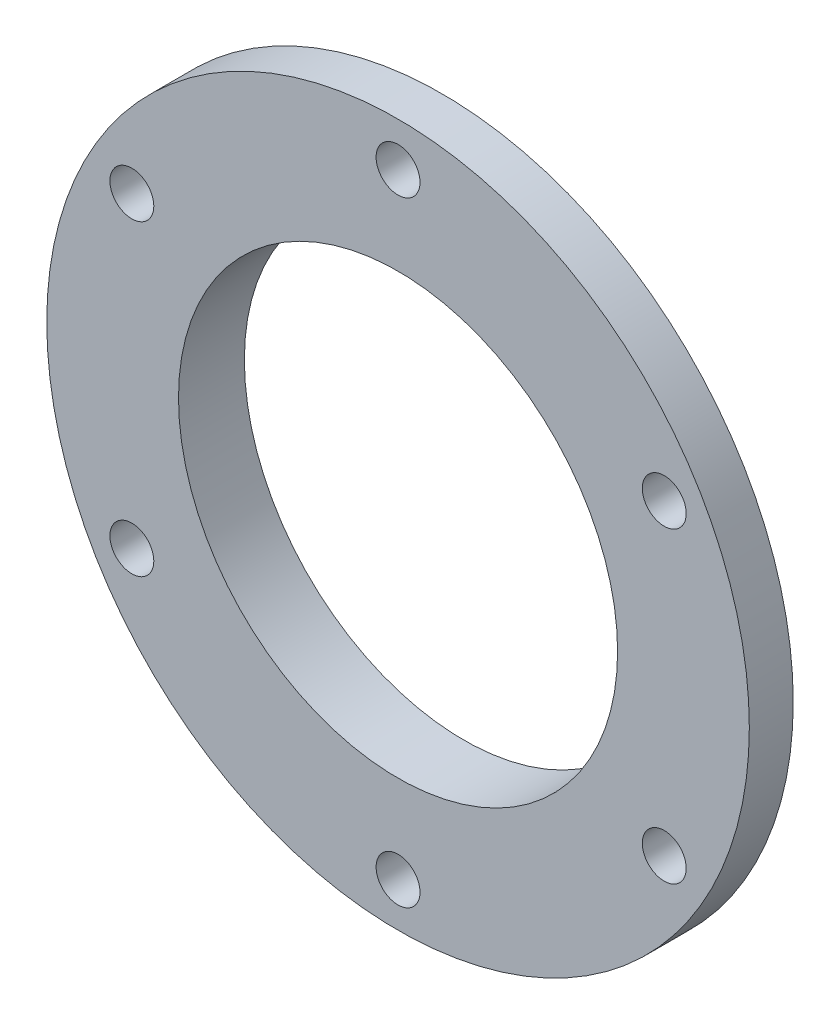
ISO-10303-21;
HEADER;
FILE_DESCRIPTION(('STEP AP214'),'2;1');
FILE_NAME('part.step','',(''),(''),'','','');
FILE_SCHEMA(('AUTOMOTIVE_DESIGN { 1 0 10303 214 1 1 1 1 }'));
ENDSEC;
DATA;
#1=APPLICATION_CONTEXT('core data for automotive mechanical design processes');
#2=APPLICATION_PROTOCOL_DEFINITION('international standard','automotive_design',2000,#1);
#3=PRODUCT_CONTEXT('',#1,'mechanical');
#4=PRODUCT('Part','Part','',(#3));
#5=PRODUCT_RELATED_PRODUCT_CATEGORY('part','',(#4));
#6=PRODUCT_DEFINITION_FORMATION('','',#4);
#7=PRODUCT_DEFINITION_CONTEXT('part definition',#1,'design');
#8=PRODUCT_DEFINITION('design','',#6,#7);
#9=PRODUCT_DEFINITION_SHAPE('','',#8);
#10=(LENGTH_UNIT() NAMED_UNIT(*) SI_UNIT(.MILLI.,.METRE.));
#11=(NAMED_UNIT(*) PLANE_ANGLE_UNIT() SI_UNIT($,.RADIAN.));
#12=(NAMED_UNIT(*) SI_UNIT($,.STERADIAN.) SOLID_ANGLE_UNIT());
#13=UNCERTAINTY_MEASURE_WITH_UNIT(LENGTH_MEASURE(1.E-05),#10,'distance_accuracy_value','');
#14=(GEOMETRIC_REPRESENTATION_CONTEXT(3) GLOBAL_UNCERTAINTY_ASSIGNED_CONTEXT((#13)) GLOBAL_UNIT_ASSIGNED_CONTEXT((#10,
#11,#12)) REPRESENTATION_CONTEXT('',''));
#15=CARTESIAN_POINT('',(0.,0.,0.));
#16=DIRECTION('',(0.,0.,1.));
#17=DIRECTION('',(1.,0.,0.));
#18=AXIS2_PLACEMENT_3D('',#15,#16,#17);
#19=CARTESIAN_POINT('',(0.,0.,0.));
#20=DIRECTION('',(0.,0.,1.));
#21=DIRECTION('',(1.,0.,0.));
#22=AXIS2_PLACEMENT_3D('',#19,#20,#21);
#23=PLANE('',#22);
#24=CARTESIAN_POINT('',(0.,35.,0.));
#25=DIRECTION('',(0.,0.,1.));
#26=DIRECTION('',(1.,0.,0.));
#27=AXIS2_PLACEMENT_3D('',#24,#25,#26);
#28=CIRCLE('',#27,2.5);
#29=CARTESIAN_POINT('',(2.5,35.,0.));
#30=VERTEX_POINT('',#29);
#31=EDGE_CURVE('E87',#30,#30,#28,.T.);
#32=ORIENTED_EDGE('',*,*,#31,.T.);
#33=EDGE_LOOP('',(#32));
#34=FACE_BOUND('',#33,.T.);
#35=CARTESIAN_POINT('',(-30.3108891324554,17.5,0.));
#36=DIRECTION('',(0.,0.,1.));
#37=DIRECTION('',(1.,0.,0.));
#38=AXIS2_PLACEMENT_3D('',#35,#36,#37);
#39=CIRCLE('',#38,2.5);
#40=CARTESIAN_POINT('',(-27.8108891324554,17.5,0.));
#41=VERTEX_POINT('',#40);
#42=EDGE_CURVE('E88',#41,#41,#39,.T.);
#43=ORIENTED_EDGE('',*,*,#42,.T.);
#44=EDGE_LOOP('',(#43));
#45=FACE_BOUND('',#44,.T.);
#46=CARTESIAN_POINT('',(-30.3108891324553,-17.5,0.));
#47=DIRECTION('',(0.,0.,1.));
#48=DIRECTION('',(1.,0.,0.));
#49=AXIS2_PLACEMENT_3D('',#46,#47,#48);
#50=CIRCLE('',#49,2.5);
#51=CARTESIAN_POINT('',(-27.8108891324553,-17.5,0.));
#52=VERTEX_POINT('',#51);
#53=EDGE_CURVE('E62',#52,#52,#50,.T.);
#54=ORIENTED_EDGE('',*,*,#53,.T.);
#55=EDGE_LOOP('',(#54));
#56=FACE_BOUND('',#55,.T.);
#57=CARTESIAN_POINT('',(0.,-35.,0.));
#58=DIRECTION('',(0.,0.,1.));
#59=DIRECTION('',(1.,0.,0.));
#60=AXIS2_PLACEMENT_3D('',#57,#58,#59);
#61=CIRCLE('',#60,2.5);
#62=CARTESIAN_POINT('',(2.50000000000001,-35.,0.));
#63=VERTEX_POINT('',#62);
#64=EDGE_CURVE('E69',#63,#63,#61,.T.);
#65=ORIENTED_EDGE('',*,*,#64,.T.);
#66=EDGE_LOOP('',(#65));
#67=FACE_BOUND('',#66,.T.);
#68=CARTESIAN_POINT('',(30.3108891324554,-17.5,0.));
#69=DIRECTION('',(0.,0.,1.));
#70=DIRECTION('',(1.,0.,0.));
#71=AXIS2_PLACEMENT_3D('',#68,#69,#70);
#72=CIRCLE('',#71,2.5);
#73=CARTESIAN_POINT('',(32.8108891324554,-17.5,0.));
#74=VERTEX_POINT('',#73);
#75=EDGE_CURVE('E75',#74,#74,#72,.T.);
#76=ORIENTED_EDGE('',*,*,#75,.T.);
#77=EDGE_LOOP('',(#76));
#78=FACE_BOUND('',#77,.T.);
#79=CARTESIAN_POINT('',(30.3108891324554,17.5,0.));
#80=DIRECTION('',(0.,0.,1.));
#81=DIRECTION('',(1.,0.,0.));
#82=AXIS2_PLACEMENT_3D('',#79,#80,#81);
#83=CIRCLE('',#82,2.50000000000001);
#84=CARTESIAN_POINT('',(32.8108891324554,17.5,0.));
#85=VERTEX_POINT('',#84);
#86=EDGE_CURVE('E81',#85,#85,#83,.T.);
#87=ORIENTED_EDGE('',*,*,#86,.T.);
#88=EDGE_LOOP('',(#87));
#89=FACE_BOUND('',#88,.T.);
#90=CARTESIAN_POINT('',(0.,0.,0.));
#91=DIRECTION('',(0.,0.,1.));
#92=DIRECTION('',(1.,0.,0.));
#93=AXIS2_PLACEMENT_3D('',#90,#91,#92);
#94=CIRCLE('',#93,40.);
#95=CARTESIAN_POINT('',(40.,0.,0.));
#96=VERTEX_POINT('',#95);
#97=EDGE_CURVE('E46',#96,#96,#94,.T.);
#98=ORIENTED_EDGE('',*,*,#97,.F.);
#99=EDGE_LOOP('',(#98));
#100=FACE_BOUND('',#99,.T.);
#101=CARTESIAN_POINT('',(0.,0.,0.));
#102=DIRECTION('',(0.,0.,1.));
#103=DIRECTION('',(1.,0.,0.));
#104=AXIS2_PLACEMENT_3D('',#101,#102,#103);
#105=CIRCLE('',#104,30.);
#106=CARTESIAN_POINT('',(30.,0.,0.));
#107=VERTEX_POINT('',#106);
#108=EDGE_CURVE('E10',#107,#107,#105,.F.);
#109=ORIENTED_EDGE('',*,*,#108,.F.);
#110=EDGE_LOOP('',(#109));
#111=FACE_BOUND('',#110,.T.);
#112=ADVANCED_FACE('F35',(#34,#45,#56,#67,#78,#89,#100,#111),#23,.F.);
#113=CARTESIAN_POINT('',(0.,0.,5.));
#114=DIRECTION('',(0.,0.,1.));
#115=DIRECTION('',(1.,0.,0.));
#116=AXIS2_PLACEMENT_3D('',#113,#114,#115);
#117=PLANE('',#116);
#118=CARTESIAN_POINT('',(0.,35.,5.));
#119=DIRECTION('',(0.,0.,1.));
#120=DIRECTION('',(1.,0.,0.));
#121=AXIS2_PLACEMENT_3D('',#118,#119,#120);
#122=CIRCLE('',#121,2.5);
#123=CARTESIAN_POINT('',(2.5,35.,5.));
#124=VERTEX_POINT('',#123);
#125=EDGE_CURVE('E61',#124,#124,#122,.T.);
#126=ORIENTED_EDGE('',*,*,#125,.F.);
#127=EDGE_LOOP('',(#126));
#128=FACE_BOUND('',#127,.T.);
#129=CARTESIAN_POINT('',(-30.3108891324554,17.5,5.));
#130=DIRECTION('',(0.,0.,1.));
#131=DIRECTION('',(1.,0.,0.));
#132=AXIS2_PLACEMENT_3D('',#129,#130,#131);
#133=CIRCLE('',#132,2.5);
#134=CARTESIAN_POINT('',(-27.8108891324554,17.5,5.));
#135=VERTEX_POINT('',#134);
#136=EDGE_CURVE('E66',#135,#135,#133,.T.);
#137=ORIENTED_EDGE('',*,*,#136,.F.);
#138=EDGE_LOOP('',(#137));
#139=FACE_BOUND('',#138,.T.);
#140=CARTESIAN_POINT('',(-30.3108891324553,-17.5,5.));
#141=DIRECTION('',(0.,0.,1.));
#142=DIRECTION('',(1.,0.,0.));
#143=AXIS2_PLACEMENT_3D('',#140,#141,#142);
#144=CIRCLE('',#143,2.5);
#145=CARTESIAN_POINT('',(-27.8108891324553,-17.5,5.));
#146=VERTEX_POINT('',#145);
#147=EDGE_CURVE('E65',#146,#146,#144,.T.);
#148=ORIENTED_EDGE('',*,*,#147,.F.);
#149=EDGE_LOOP('',(#148));
#150=FACE_BOUND('',#149,.T.);
#151=CARTESIAN_POINT('',(0.,-35.,5.));
#152=DIRECTION('',(0.,0.,1.));
#153=DIRECTION('',(1.,0.,0.));
#154=AXIS2_PLACEMENT_3D('',#151,#152,#153);
#155=CIRCLE('',#154,2.5);
#156=CARTESIAN_POINT('',(2.50000000000001,-35.,5.));
#157=VERTEX_POINT('',#156);
#158=EDGE_CURVE('E72',#157,#157,#155,.T.);
#159=ORIENTED_EDGE('',*,*,#158,.F.);
#160=EDGE_LOOP('',(#159));
#161=FACE_BOUND('',#160,.T.);
#162=CARTESIAN_POINT('',(30.3108891324554,-17.5,5.));
#163=DIRECTION('',(0.,0.,1.));
#164=DIRECTION('',(1.,0.,0.));
#165=AXIS2_PLACEMENT_3D('',#162,#163,#164);
#166=CIRCLE('',#165,2.5);
#167=CARTESIAN_POINT('',(32.8108891324554,-17.5,5.));
#168=VERTEX_POINT('',#167);
#169=EDGE_CURVE('E78',#168,#168,#166,.T.);
#170=ORIENTED_EDGE('',*,*,#169,.F.);
#171=EDGE_LOOP('',(#170));
#172=FACE_BOUND('',#171,.T.);
#173=CARTESIAN_POINT('',(30.3108891324554,17.5,5.));
#174=DIRECTION('',(0.,0.,1.));
#175=DIRECTION('',(1.,0.,0.));
#176=AXIS2_PLACEMENT_3D('',#173,#174,#175);
#177=CIRCLE('',#176,2.50000000000001);
#178=CARTESIAN_POINT('',(32.8108891324554,17.5,5.));
#179=VERTEX_POINT('',#178);
#180=EDGE_CURVE('E84',#179,#179,#177,.T.);
#181=ORIENTED_EDGE('',*,*,#180,.F.);
#182=EDGE_LOOP('',(#181));
#183=FACE_BOUND('',#182,.T.);
#184=CARTESIAN_POINT('',(0.,0.,5.));
#185=DIRECTION('',(0.,0.,1.));
#186=DIRECTION('',(1.,0.,0.));
#187=AXIS2_PLACEMENT_3D('',#184,#185,#186);
#188=CIRCLE('',#187,40.);
#189=CARTESIAN_POINT('',(40.,0.,5.));
#190=VERTEX_POINT('',#189);
#191=EDGE_CURVE('E42',#190,#190,#188,.T.);
#192=ORIENTED_EDGE('',*,*,#191,.T.);
#193=EDGE_LOOP('',(#192));
#194=FACE_BOUND('',#193,.T.);
#195=CARTESIAN_POINT('',(0.,0.,5.));
#196=DIRECTION('',(0.,0.,1.));
#197=DIRECTION('',(1.,0.,0.));
#198=AXIS2_PLACEMENT_3D('',#195,#196,#197);
#199=CIRCLE('',#198,25.);
#200=CARTESIAN_POINT('',(25.,0.,5.));
#201=VERTEX_POINT('',#200);
#202=EDGE_CURVE('E51',#201,#201,#199,.T.);
#203=ORIENTED_EDGE('',*,*,#202,.F.);
#204=EDGE_LOOP('',(#203));
#205=FACE_BOUND('',#204,.T.);
#206=ADVANCED_FACE('F101',(#128,#139,#150,#161,#172,#183,#194,#205),#117,.T.);
#207=CARTESIAN_POINT('',(0.,0.,5.));
#208=DIRECTION('',(0.,0.,-1.));
#209=DIRECTION('',(-1.,0.,0.));
#210=AXIS2_PLACEMENT_3D('',#207,#208,#209);
#211=CYLINDRICAL_SURFACE('',#210,40.);
#212=ORIENTED_EDGE('',*,*,#191,.F.);
#213=EDGE_LOOP('',(#212));
#214=FACE_BOUND('',#213,.T.);
#215=ORIENTED_EDGE('',*,*,#97,.T.);
#216=EDGE_LOOP('',(#215));
#217=FACE_BOUND('',#216,.T.);
#218=ADVANCED_FACE('F37',(#214,#217),#211,.T.);
#219=CARTESIAN_POINT('',(0.,0.,5.));
#220=DIRECTION('',(0.,0.,-1.));
#221=DIRECTION('',(-1.,0.,0.));
#222=AXIS2_PLACEMENT_3D('',#219,#220,#221);
#223=CYLINDRICAL_SURFACE('',#222,25.);
#224=ORIENTED_EDGE('',*,*,#202,.T.);
#225=EDGE_LOOP('',(#224));
#226=FACE_BOUND('',#225,.T.);
#227=CARTESIAN_POINT('',(0.,0.,-2.5));
#228=DIRECTION('',(0.,0.,-1.));
#229=DIRECTION('',(-1.,0.,0.));
#230=AXIS2_PLACEMENT_3D('',#227,#228,#229);
#231=CIRCLE('',#230,25.);
#232=CARTESIAN_POINT('',(-25.,0.,-2.5));
#233=VERTEX_POINT('',#232);
#234=EDGE_CURVE('E58',#233,#233,#231,.T.);
#235=ORIENTED_EDGE('',*,*,#234,.T.);
#236=EDGE_LOOP('',(#235));
#237=FACE_BOUND('',#236,.T.);
#238=ADVANCED_FACE('F117',(#226,#237),#223,.F.);
#239=CARTESIAN_POINT('',(0.,0.,-2.5));
#240=DIRECTION('',(0.,0.,-1.));
#241=DIRECTION('',(-1.,0.,0.));
#242=AXIS2_PLACEMENT_3D('',#239,#240,#241);
#243=PLANE('',#242);
#244=CARTESIAN_POINT('',(0.,0.,-2.5));
#245=DIRECTION('',(0.,0.,-1.));
#246=DIRECTION('',(-1.,0.,0.));
#247=AXIS2_PLACEMENT_3D('',#244,#245,#246);
#248=CIRCLE('',#247,30.);
#249=CARTESIAN_POINT('',(-30.,0.,-2.5));
#250=VERTEX_POINT('',#249);
#251=EDGE_CURVE('E55',#250,#250,#248,.T.);
#252=ORIENTED_EDGE('',*,*,#251,.T.);
#253=EDGE_LOOP('',(#252));
#254=FACE_BOUND('',#253,.T.);
#255=ORIENTED_EDGE('',*,*,#234,.F.);
#256=EDGE_LOOP('',(#255));
#257=FACE_BOUND('',#256,.T.);
#258=ADVANCED_FACE('F120',(#254,#257),#243,.T.);
#259=CARTESIAN_POINT('',(0.,0.,-2.5));
#260=DIRECTION('',(0.,0.,1.));
#261=DIRECTION('',(1.,0.,0.));
#262=AXIS2_PLACEMENT_3D('',#259,#260,#261);
#263=CYLINDRICAL_SURFACE('',#262,30.);
#264=ORIENTED_EDGE('',*,*,#251,.F.);
#265=EDGE_LOOP('',(#264));
#266=FACE_BOUND('',#265,.T.);
#267=ORIENTED_EDGE('',*,*,#108,.T.);
#268=EDGE_LOOP('',(#267));
#269=FACE_BOUND('',#268,.T.);
#270=ADVANCED_FACE('F125',(#266,#269),#263,.T.);
#271=CARTESIAN_POINT('',(30.3108891324554,17.5,5.));
#272=DIRECTION('',(0.,0.,-1.));
#273=DIRECTION('',(-1.,0.,0.));
#274=AXIS2_PLACEMENT_3D('',#271,#272,#273);
#275=CYLINDRICAL_SURFACE('',#274,2.50000000000001);
#276=ORIENTED_EDGE('',*,*,#180,.T.);
#277=EDGE_LOOP('',(#276));
#278=FACE_BOUND('',#277,.T.);
#279=ORIENTED_EDGE('',*,*,#86,.F.);
#280=EDGE_LOOP('',(#279));
#281=FACE_BOUND('',#280,.T.);
#282=ADVANCED_FACE('F131',(#278,#281),#275,.F.);
#283=CARTESIAN_POINT('',(30.3108891324554,-17.5,5.));
#284=DIRECTION('',(0.,0.,-1.));
#285=DIRECTION('',(-1.,0.,0.));
#286=AXIS2_PLACEMENT_3D('',#283,#284,#285);
#287=CYLINDRICAL_SURFACE('',#286,2.5);
#288=ORIENTED_EDGE('',*,*,#169,.T.);
#289=EDGE_LOOP('',(#288));
#290=FACE_BOUND('',#289,.T.);
#291=ORIENTED_EDGE('',*,*,#75,.F.);
#292=EDGE_LOOP('',(#291));
#293=FACE_BOUND('',#292,.T.);
#294=ADVANCED_FACE('F192',(#290,#293),#287,.F.);
#295=CARTESIAN_POINT('',(0.,-35.,5.));
#296=DIRECTION('',(0.,0.,-1.));
#297=DIRECTION('',(-1.,0.,0.));
#298=AXIS2_PLACEMENT_3D('',#295,#296,#297);
#299=CYLINDRICAL_SURFACE('',#298,2.5);
#300=ORIENTED_EDGE('',*,*,#158,.T.);
#301=EDGE_LOOP('',(#300));
#302=FACE_BOUND('',#301,.T.);
#303=ORIENTED_EDGE('',*,*,#64,.F.);
#304=EDGE_LOOP('',(#303));
#305=FACE_BOUND('',#304,.T.);
#306=ADVANCED_FACE('F202',(#302,#305),#299,.F.);
#307=CARTESIAN_POINT('',(-30.3108891324553,-17.5,5.));
#308=DIRECTION('',(0.,0.,-1.));
#309=DIRECTION('',(-1.,0.,0.));
#310=AXIS2_PLACEMENT_3D('',#307,#308,#309);
#311=CYLINDRICAL_SURFACE('',#310,2.5);
#312=ORIENTED_EDGE('',*,*,#147,.T.);
#313=EDGE_LOOP('',(#312));
#314=FACE_BOUND('',#313,.T.);
#315=ORIENTED_EDGE('',*,*,#53,.F.);
#316=EDGE_LOOP('',(#315));
#317=FACE_BOUND('',#316,.T.);
#318=ADVANCED_FACE('F212',(#314,#317),#311,.F.);
#319=CARTESIAN_POINT('',(-30.3108891324554,17.5,5.));
#320=DIRECTION('',(0.,0.,-1.));
#321=DIRECTION('',(-1.,0.,0.));
#322=AXIS2_PLACEMENT_3D('',#319,#320,#321);
#323=CYLINDRICAL_SURFACE('',#322,2.5);
#324=ORIENTED_EDGE('',*,*,#136,.T.);
#325=EDGE_LOOP('',(#324));
#326=FACE_BOUND('',#325,.T.);
#327=ORIENTED_EDGE('',*,*,#42,.F.);
#328=EDGE_LOOP('',(#327));
#329=FACE_BOUND('',#328,.T.);
#330=ADVANCED_FACE('F222',(#326,#329),#323,.F.);
#331=CARTESIAN_POINT('',(0.,35.,5.));
#332=DIRECTION('',(0.,0.,-1.));
#333=DIRECTION('',(-1.,0.,0.));
#334=AXIS2_PLACEMENT_3D('',#331,#332,#333);
#335=CYLINDRICAL_SURFACE('',#334,2.5);
#336=ORIENTED_EDGE('',*,*,#125,.T.);
#337=EDGE_LOOP('',(#336));
#338=FACE_BOUND('',#337,.T.);
#339=ORIENTED_EDGE('',*,*,#31,.F.);
#340=EDGE_LOOP('',(#339));
#341=FACE_BOUND('',#340,.T.);
#342=ADVANCED_FACE('F98',(#338,#341),#335,.F.);
#343=CLOSED_SHELL('',(#112,#206,#218,#238,#258,#270,#282,#294,#306,#318,#330,#342));
#344=MANIFOLD_SOLID_BREP('B2',#343);
#345=ADVANCED_BREP_SHAPE_REPRESENTATION('',(#18,#344),#14);
#346=SHAPE_DEFINITION_REPRESENTATION(#9,#345);
ENDSEC;
END-ISO-10303-21;
